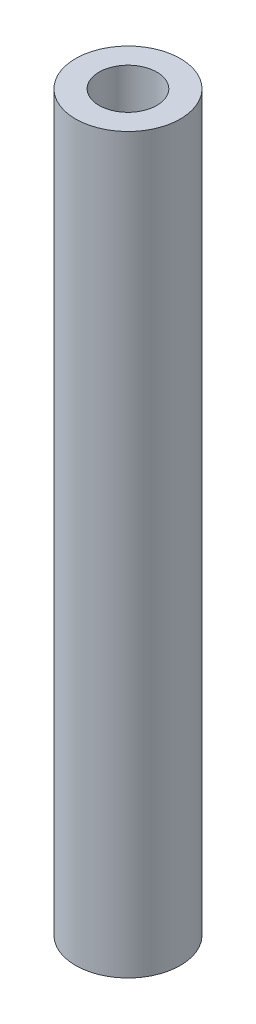
ISO-10303-21;
HEADER;
FILE_DESCRIPTION(('STEP AP214'),'2;1');
FILE_NAME('part.step','',(''),(''),'','','');
FILE_SCHEMA(('AUTOMOTIVE_DESIGN { 1 0 10303 214 1 1 1 1 }'));
ENDSEC;
DATA;
#1=APPLICATION_CONTEXT('core data for automotive mechanical design processes');
#2=APPLICATION_PROTOCOL_DEFINITION('international standard','automotive_design',2000,#1);
#3=PRODUCT_CONTEXT('',#1,'mechanical');
#4=PRODUCT('Part','Part','',(#3));
#5=PRODUCT_RELATED_PRODUCT_CATEGORY('part','',(#4));
#6=PRODUCT_DEFINITION_FORMATION('','',#4);
#7=PRODUCT_DEFINITION_CONTEXT('part definition',#1,'design');
#8=PRODUCT_DEFINITION('design','',#6,#7);
#9=PRODUCT_DEFINITION_SHAPE('','',#8);
#10=(LENGTH_UNIT() NAMED_UNIT(*) SI_UNIT(.MILLI.,.METRE.));
#11=(NAMED_UNIT(*) PLANE_ANGLE_UNIT() SI_UNIT($,.RADIAN.));
#12=(NAMED_UNIT(*) SI_UNIT($,.STERADIAN.) SOLID_ANGLE_UNIT());
#13=UNCERTAINTY_MEASURE_WITH_UNIT(LENGTH_MEASURE(1.E-05),#10,'distance_accuracy_value','');
#14=(GEOMETRIC_REPRESENTATION_CONTEXT(3) GLOBAL_UNCERTAINTY_ASSIGNED_CONTEXT((#13)) GLOBAL_UNIT_ASSIGNED_CONTEXT((#10,
#11,#12)) REPRESENTATION_CONTEXT('',''));
#15=CARTESIAN_POINT('',(0.,0.,0.));
#16=DIRECTION('',(0.,0.,1.));
#17=DIRECTION('',(1.,0.,0.));
#18=AXIS2_PLACEMENT_3D('',#15,#16,#17);
#19=CARTESIAN_POINT('',(0.,44.45,0.));
#20=DIRECTION('',(0.,1.,0.));
#21=DIRECTION('',(0.,0.,1.));
#22=AXIS2_PLACEMENT_3D('',#19,#20,#21);
#23=PLANE('',#22);
#24=CARTESIAN_POINT('',(0.,44.45,0.));
#25=DIRECTION('',(0.,1.,0.));
#26=DIRECTION('',(0.,0.,1.));
#27=AXIS2_PLACEMENT_3D('',#24,#25,#26);
#28=CIRCLE('',#27,3.175);
#29=CARTESIAN_POINT('',(0.,44.45,3.175));
#30=VERTEX_POINT('',#29);
#31=EDGE_CURVE('E10',#30,#30,#28,.T.);
#32=ORIENTED_EDGE('',*,*,#31,.T.);
#33=EDGE_LOOP('',(#32));
#34=FACE_BOUND('',#33,.T.);
#35=CARTESIAN_POINT('',(0.,44.45,0.));
#36=DIRECTION('',(0.,1.,0.));
#37=DIRECTION('',(0.,0.,1.));
#38=AXIS2_PLACEMENT_3D('',#35,#36,#37);
#39=CIRCLE('',#38,1.7526);
#40=CARTESIAN_POINT('',(0.,44.45,1.7526));
#41=VERTEX_POINT('',#40);
#42=EDGE_CURVE('E54',#41,#41,#39,.T.);
#43=ORIENTED_EDGE('',*,*,#42,.F.);
#44=EDGE_LOOP('',(#43));
#45=FACE_BOUND('',#44,.T.);
#46=ADVANCED_FACE('F41',(#34,#45),#23,.T.);
#47=CARTESIAN_POINT('',(0.,0.,0.));
#48=DIRECTION('',(0.,1.,0.));
#49=DIRECTION('',(0.,0.,1.));
#50=AXIS2_PLACEMENT_3D('',#47,#48,#49);
#51=PLANE('',#50);
#52=CARTESIAN_POINT('',(0.,0.,0.));
#53=DIRECTION('',(0.,1.,0.));
#54=DIRECTION('',(0.,0.,1.));
#55=AXIS2_PLACEMENT_3D('',#52,#53,#54);
#56=CIRCLE('',#55,3.175);
#57=CARTESIAN_POINT('',(0.,0.,3.175));
#58=VERTEX_POINT('',#57);
#59=EDGE_CURVE('E45',#58,#58,#56,.T.);
#60=ORIENTED_EDGE('',*,*,#59,.F.);
#61=EDGE_LOOP('',(#60));
#62=FACE_BOUND('',#61,.T.);
#63=CARTESIAN_POINT('',(0.,0.,0.));
#64=DIRECTION('',(0.,1.,0.));
#65=DIRECTION('',(0.,0.,1.));
#66=AXIS2_PLACEMENT_3D('',#63,#64,#65);
#67=CIRCLE('',#66,1.7526);
#68=CARTESIAN_POINT('',(0.,0.,1.7526));
#69=VERTEX_POINT('',#68);
#70=EDGE_CURVE('E56',#69,#69,#67,.T.);
#71=ORIENTED_EDGE('',*,*,#70,.T.);
#72=EDGE_LOOP('',(#71));
#73=FACE_BOUND('',#72,.T.);
#74=ADVANCED_FACE('F68',(#62,#73),#51,.F.);
#75=CARTESIAN_POINT('',(0.,44.45,0.));
#76=DIRECTION('',(0.,-1.,0.));
#77=DIRECTION('',(0.,0.,-1.));
#78=AXIS2_PLACEMENT_3D('',#75,#76,#77);
#79=CYLINDRICAL_SURFACE('',#78,3.175);
#80=ORIENTED_EDGE('',*,*,#31,.F.);
#81=EDGE_LOOP('',(#80));
#82=FACE_BOUND('',#81,.T.);
#83=ORIENTED_EDGE('',*,*,#59,.T.);
#84=EDGE_LOOP('',(#83));
#85=FACE_BOUND('',#84,.T.);
#86=ADVANCED_FACE('F43',(#82,#85),#79,.T.);
#87=CARTESIAN_POINT('',(0.,44.45,0.));
#88=DIRECTION('',(0.,-1.,0.));
#89=DIRECTION('',(0.,0.,-1.));
#90=AXIS2_PLACEMENT_3D('',#87,#88,#89);
#91=CYLINDRICAL_SURFACE('',#90,1.7526);
#92=ORIENTED_EDGE('',*,*,#42,.T.);
#93=EDGE_LOOP('',(#92));
#94=FACE_BOUND('',#93,.T.);
#95=ORIENTED_EDGE('',*,*,#70,.F.);
#96=EDGE_LOOP('',(#95));
#97=FACE_BOUND('',#96,.T.);
#98=ADVANCED_FACE('F64',(#94,#97),#91,.F.);
#99=CLOSED_SHELL('',(#46,#74,#86,#98));
#100=MANIFOLD_SOLID_BREP('B2',#99);
#101=ADVANCED_BREP_SHAPE_REPRESENTATION('',(#18,#100),#14);
#102=SHAPE_DEFINITION_REPRESENTATION(#9,#101);
ENDSEC;
END-ISO-10303-21;
